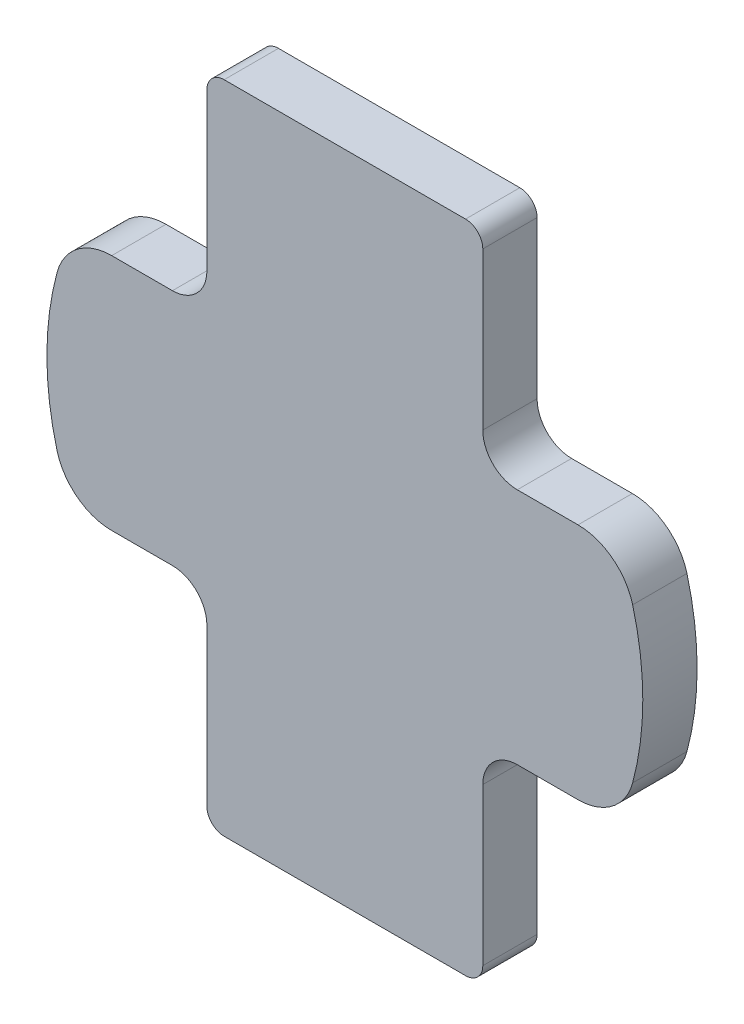
ISO-10303-21;
HEADER;
FILE_DESCRIPTION(('STEP AP214'),'2;1');
FILE_NAME('part.step','',(''),(''),'','','');
FILE_SCHEMA(('AUTOMOTIVE_DESIGN { 1 0 10303 214 1 1 1 1 }'));
ENDSEC;
DATA;
#1=APPLICATION_CONTEXT('core data for automotive mechanical design processes');
#2=APPLICATION_PROTOCOL_DEFINITION('international standard','automotive_design',2000,#1);
#3=PRODUCT_CONTEXT('',#1,'mechanical');
#4=PRODUCT('Part','Part','',(#3));
#5=PRODUCT_RELATED_PRODUCT_CATEGORY('part','',(#4));
#6=PRODUCT_DEFINITION_FORMATION('','',#4);
#7=PRODUCT_DEFINITION_CONTEXT('part definition',#1,'design');
#8=PRODUCT_DEFINITION('design','',#6,#7);
#9=PRODUCT_DEFINITION_SHAPE('','',#8);
#10=(LENGTH_UNIT() NAMED_UNIT(*) SI_UNIT(.MILLI.,.METRE.));
#11=(NAMED_UNIT(*) PLANE_ANGLE_UNIT() SI_UNIT($,.RADIAN.));
#12=(NAMED_UNIT(*) SI_UNIT($,.STERADIAN.) SOLID_ANGLE_UNIT());
#13=UNCERTAINTY_MEASURE_WITH_UNIT(LENGTH_MEASURE(1.E-05),#10,'distance_accuracy_value','');
#14=(GEOMETRIC_REPRESENTATION_CONTEXT(3) GLOBAL_UNCERTAINTY_ASSIGNED_CONTEXT((#13)) GLOBAL_UNIT_ASSIGNED_CONTEXT((#10,
#11,#12)) REPRESENTATION_CONTEXT('',''));
#15=CARTESIAN_POINT('',(0.,0.,0.));
#16=DIRECTION('',(0.,0.,1.));
#17=DIRECTION('',(1.,0.,0.));
#18=AXIS2_PLACEMENT_3D('',#15,#16,#17);
#19=CARTESIAN_POINT('',(-1.21922822000749,60.325,10.));
#20=DIRECTION('',(0.,-1.,0.));
#21=DIRECTION('',(0.,0.,-1.));
#22=AXIS2_PLACEMENT_3D('',#19,#20,#21);
#23=PLANE('',#22);
#24=DIRECTION('',(-1.,0.,0.));
#25=VECTOR('',#24,1.);
#26=CARTESIAN_POINT('',(-1.21922822000749,60.325,0.));
#27=LINE('',#26,#25);
#28=CARTESIAN_POINT('',(22.225,60.325,0.));
#29=VERTEX_POINT('',#28);
#30=CARTESIAN_POINT('',(-22.225,60.325,0.));
#31=VERTEX_POINT('',#30);
#32=EDGE_CURVE('E239',#29,#31,#27,.T.);
#33=ORIENTED_EDGE('',*,*,#32,.T.);
#34=DIRECTION('',(0.,0.,-1.));
#35=VECTOR('',#34,1.);
#36=CARTESIAN_POINT('',(-22.225,60.325,10.));
#37=LINE('',#36,#35);
#38=CARTESIAN_POINT('',(-22.225,60.325,10.));
#39=VERTEX_POINT('',#38);
#40=EDGE_CURVE('E11',#39,#31,#37,.T.);
#41=ORIENTED_EDGE('',*,*,#40,.F.);
#42=DIRECTION('',(-1.,0.,0.));
#43=VECTOR('',#42,1.);
#44=CARTESIAN_POINT('',(-1.21922822000749,60.325,10.));
#45=LINE('',#44,#43);
#46=CARTESIAN_POINT('',(22.225,60.325,10.));
#47=VERTEX_POINT('',#46);
#48=EDGE_CURVE('E302',#47,#39,#45,.T.);
#49=ORIENTED_EDGE('',*,*,#48,.F.);
#50=DIRECTION('',(0.,0.,-1.));
#51=VECTOR('',#50,1.);
#52=CARTESIAN_POINT('',(22.225,60.325,10.));
#53=LINE('',#52,#51);
#54=EDGE_CURVE('E49',#47,#29,#53,.T.);
#55=ORIENTED_EDGE('',*,*,#54,.T.);
#56=EDGE_LOOP('',(#33,#41,#49,#55));
#57=FACE_BOUND('',#56,.T.);
#58=ADVANCED_FACE('F33',(#57),#23,.F.);
#59=CARTESIAN_POINT('',(-22.225,57.15,10.));
#60=DIRECTION('',(0.,0.,-1.));
#61=DIRECTION('',(-1.,0.,0.));
#62=AXIS2_PLACEMENT_3D('',#59,#60,#61);
#63=CYLINDRICAL_SURFACE('',#62,3.175);
#64=CARTESIAN_POINT('',(-22.225,57.15,0.));
#65=DIRECTION('',(0.,0.,1.));
#66=DIRECTION('',(1.,0.,0.));
#67=AXIS2_PLACEMENT_3D('',#64,#65,#66);
#68=CIRCLE('',#67,3.175);
#69=CARTESIAN_POINT('',(-25.4,57.15,0.));
#70=VERTEX_POINT('',#69);
#71=EDGE_CURVE('E241',#31,#70,#68,.T.);
#72=ORIENTED_EDGE('',*,*,#71,.T.);
#73=DIRECTION('',(0.,0.,-1.));
#74=VECTOR('',#73,1.);
#75=CARTESIAN_POINT('',(-25.4,57.15,10.));
#76=LINE('',#75,#74);
#77=CARTESIAN_POINT('',(-25.4,57.15,10.));
#78=VERTEX_POINT('',#77);
#79=EDGE_CURVE('E41',#78,#70,#76,.T.);
#80=ORIENTED_EDGE('',*,*,#79,.F.);
#81=CARTESIAN_POINT('',(-22.225,57.15,10.));
#82=DIRECTION('',(0.,0.,1.));
#83=DIRECTION('',(1.,0.,0.));
#84=AXIS2_PLACEMENT_3D('',#81,#82,#83);
#85=CIRCLE('',#84,3.175);
#86=EDGE_CURVE('E142',#39,#78,#85,.T.);
#87=ORIENTED_EDGE('',*,*,#86,.F.);
#88=ORIENTED_EDGE('',*,*,#40,.T.);
#89=EDGE_LOOP('',(#72,#80,#87,#88));
#90=FACE_BOUND('',#89,.T.);
#91=ADVANCED_FACE('F440',(#90),#63,.T.);
#92=CARTESIAN_POINT('',(-25.4,-123.866634737692,10.));
#93=DIRECTION('',(1.,0.,0.));
#94=DIRECTION('',(0.,0.,-1.));
#95=AXIS2_PLACEMENT_3D('',#92,#93,#94);
#96=PLANE('',#95);
#97=DIRECTION('',(0.,-1.,0.));
#98=VECTOR('',#97,1.);
#99=CARTESIAN_POINT('',(-25.4,-123.866634737692,0.));
#100=LINE('',#99,#98);
#101=CARTESIAN_POINT('',(-25.4,28.2689300000001,0.));
#102=VERTEX_POINT('',#101);
#103=EDGE_CURVE('E243',#70,#102,#100,.T.);
#104=ORIENTED_EDGE('',*,*,#103,.T.);
#105=DIRECTION('',(0.,0.,-1.));
#106=VECTOR('',#105,1.);
#107=CARTESIAN_POINT('',(-25.4,28.2689300000001,10.));
#108=LINE('',#107,#106);
#109=CARTESIAN_POINT('',(-25.4,28.2689300000001,10.));
#110=VERTEX_POINT('',#109);
#111=EDGE_CURVE('E352',#110,#102,#108,.T.);
#112=ORIENTED_EDGE('',*,*,#111,.F.);
#113=DIRECTION('',(0.,-1.,0.));
#114=VECTOR('',#113,1.);
#115=CARTESIAN_POINT('',(-25.4,-123.866634737692,10.));
#116=LINE('',#115,#114);
#117=EDGE_CURVE('E360',#78,#110,#116,.T.);
#118=ORIENTED_EDGE('',*,*,#117,.F.);
#119=ORIENTED_EDGE('',*,*,#79,.T.);
#120=EDGE_LOOP('',(#104,#112,#118,#119));
#121=FACE_BOUND('',#120,.T.);
#122=ADVANCED_FACE('F358',(#121),#96,.F.);
#123=CARTESIAN_POINT('',(-31.75,28.26893,10.));
#124=DIRECTION('',(0.,0.,-1.));
#125=DIRECTION('',(-1.,0.,0.));
#126=AXIS2_PLACEMENT_3D('',#123,#124,#125);
#127=CYLINDRICAL_SURFACE('',#126,6.35);
#128=CARTESIAN_POINT('',(-31.75,28.26893,0.));
#129=DIRECTION('',(0.,0.,1.));
#130=DIRECTION('',(1.,0.,0.));
#131=AXIS2_PLACEMENT_3D('',#128,#129,#130);
#132=CIRCLE('',#131,6.35);
#133=CARTESIAN_POINT('',(-31.75,21.91893,0.));
#134=VERTEX_POINT('',#133);
#135=EDGE_CURVE('E245',#102,#134,#132,.F.);
#136=ORIENTED_EDGE('',*,*,#135,.T.);
#137=DIRECTION('',(0.,0.,-1.));
#138=VECTOR('',#137,1.);
#139=CARTESIAN_POINT('',(-31.75,21.91893,10.));
#140=LINE('',#139,#138);
#141=CARTESIAN_POINT('',(-31.75,21.91893,10.));
#142=VERTEX_POINT('',#141);
#143=EDGE_CURVE('E349',#142,#134,#140,.T.);
#144=ORIENTED_EDGE('',*,*,#143,.F.);
#145=CARTESIAN_POINT('',(-31.75,28.26893,10.));
#146=DIRECTION('',(0.,0.,1.));
#147=DIRECTION('',(1.,0.,0.));
#148=AXIS2_PLACEMENT_3D('',#145,#146,#147);
#149=CIRCLE('',#148,6.35);
#150=EDGE_CURVE('E377',#110,#142,#149,.F.);
#151=ORIENTED_EDGE('',*,*,#150,.F.);
#152=ORIENTED_EDGE('',*,*,#111,.T.);
#153=EDGE_LOOP('',(#136,#144,#151,#152));
#154=FACE_BOUND('',#153,.T.);
#155=ADVANCED_FACE('F368',(#154),#127,.F.);
#156=CARTESIAN_POINT('',(-1.21922822000744,21.91893,10.));
#157=DIRECTION('',(0.,-1.,0.));
#158=DIRECTION('',(1.,0.,0.));
#159=AXIS2_PLACEMENT_3D('',#156,#157,#158);
#160=PLANE('',#159);
#161=DIRECTION('',(-1.,0.,0.));
#162=VECTOR('',#161,1.);
#163=CARTESIAN_POINT('',(-1.21922822000744,21.91893,0.));
#164=LINE('',#163,#162);
#165=CARTESIAN_POINT('',(-42.9352895145136,21.91893,0.));
#166=VERTEX_POINT('',#165);
#167=EDGE_CURVE('E247',#134,#166,#164,.T.);
#168=ORIENTED_EDGE('',*,*,#167,.T.);
#169=DIRECTION('',(0.,0.,-1.));
#170=VECTOR('',#169,1.);
#171=CARTESIAN_POINT('',(-42.9352895145136,21.91893,10.));
#172=LINE('',#171,#170);
#173=CARTESIAN_POINT('',(-42.9352895145136,21.91893,10.));
#174=VERTEX_POINT('',#173);
#175=EDGE_CURVE('E346',#174,#166,#172,.T.);
#176=ORIENTED_EDGE('',*,*,#175,.F.);
#177=DIRECTION('',(-1.,0.,0.));
#178=VECTOR('',#177,1.);
#179=CARTESIAN_POINT('',(-1.21922822000744,21.91893,10.));
#180=LINE('',#179,#178);
#181=EDGE_CURVE('E374',#142,#174,#180,.T.);
#182=ORIENTED_EDGE('',*,*,#181,.F.);
#183=ORIENTED_EDGE('',*,*,#143,.T.);
#184=EDGE_LOOP('',(#168,#176,#182,#183));
#185=FACE_BOUND('',#184,.T.);
#186=ADVANCED_FACE('F372',(#185),#160,.F.);
#187=CARTESIAN_POINT('',(-42.9352895145136,11.50493,10.));
#188=DIRECTION('',(0.,0.,-1.));
#189=DIRECTION('',(-1.,0.,0.));
#190=AXIS2_PLACEMENT_3D('',#187,#188,#189);
#191=CYLINDRICAL_SURFACE('',#190,10.414);
#192=CARTESIAN_POINT('',(-42.9352895145136,11.50493,0.));
#193=DIRECTION('',(0.,0.,1.));
#194=DIRECTION('',(1.,0.,0.));
#195=AXIS2_PLACEMENT_3D('',#192,#193,#194);
#196=CIRCLE('',#195,10.414);
#197=CARTESIAN_POINT('',(-52.9944144864853,14.2003707428571,0.));
#198=VERTEX_POINT('',#197);
#199=EDGE_CURVE('E249',#166,#198,#196,.T.);
#200=ORIENTED_EDGE('',*,*,#199,.T.);
#201=DIRECTION('',(0.,0.,-1.));
#202=VECTOR('',#201,1.);
#203=CARTESIAN_POINT('',(-52.9944144864853,14.2003707428571,10.));
#204=LINE('',#203,#202);
#205=CARTESIAN_POINT('',(-52.9944144864853,14.2003707428571,10.));
#206=VERTEX_POINT('',#205);
#207=EDGE_CURVE('E343',#206,#198,#204,.T.);
#208=ORIENTED_EDGE('',*,*,#207,.F.);
#209=CARTESIAN_POINT('',(-42.9352895145136,11.50493,10.));
#210=DIRECTION('',(0.,0.,1.));
#211=DIRECTION('',(1.,0.,0.));
#212=AXIS2_PLACEMENT_3D('',#209,#210,#211);
#213=CIRCLE('',#212,10.414);
#214=EDGE_CURVE('E376',#174,#206,#213,.T.);
#215=ORIENTED_EDGE('',*,*,#214,.F.);
#216=ORIENTED_EDGE('',*,*,#175,.T.);
#217=EDGE_LOOP('',(#200,#208,#215,#216));
#218=FACE_BOUND('',#217,.T.);
#219=ADVANCED_FACE('F456',(#218),#191,.T.);
#220=CARTESIAN_POINT('',(0.,0.,10.));
#221=DIRECTION('',(0.,0.,-1.));
#222=DIRECTION('',(-1.,0.,0.));
#223=AXIS2_PLACEMENT_3D('',#220,#221,#222);
#224=CYLINDRICAL_SURFACE('',#223,54.864);
#225=CARTESIAN_POINT('',(0.,0.,0.));
#226=DIRECTION('',(0.,0.,1.));
#227=DIRECTION('',(1.,0.,0.));
#228=AXIS2_PLACEMENT_3D('',#225,#226,#227);
#229=CIRCLE('',#228,54.864);
#230=CARTESIAN_POINT('',(-54.864,0.0215978902018688,0.));
#231=VERTEX_POINT('',#230);
#232=EDGE_CURVE('E251',#198,#231,#229,.T.);
#233=ORIENTED_EDGE('',*,*,#232,.T.);
#234=DIRECTION('',(0.,0.,-1.));
#235=VECTOR('',#234,1.);
#236=CARTESIAN_POINT('',(-54.864,0.0215978902018688,10.));
#237=LINE('',#236,#235);
#238=CARTESIAN_POINT('',(-54.864,0.0215978902018688,10.));
#239=VERTEX_POINT('',#238);
#240=EDGE_CURVE('E340',#239,#231,#237,.T.);
#241=ORIENTED_EDGE('',*,*,#240,.F.);
#242=CARTESIAN_POINT('',(0.,0.,10.));
#243=DIRECTION('',(0.,0.,1.));
#244=DIRECTION('',(1.,0.,0.));
#245=AXIS2_PLACEMENT_3D('',#242,#243,#244);
#246=CIRCLE('',#245,54.864);
#247=EDGE_CURVE('E379',#206,#239,#246,.T.);
#248=ORIENTED_EDGE('',*,*,#247,.F.);
#249=ORIENTED_EDGE('',*,*,#207,.T.);
#250=EDGE_LOOP('',(#233,#241,#248,#249));
#251=FACE_BOUND('',#250,.T.);
#252=ADVANCED_FACE('F459',(#251),#224,.T.);
#253=CARTESIAN_POINT('',(-54.864,-123.866634737692,10.));
#254=DIRECTION('',(1.,0.,0.));
#255=DIRECTION('',(0.,0.,-1.));
#256=AXIS2_PLACEMENT_3D('',#253,#254,#255);
#257=PLANE('',#256);
#258=DIRECTION('',(0.,-1.,0.));
#259=VECTOR('',#258,1.);
#260=CARTESIAN_POINT('',(-54.864,-123.866634737692,0.));
#261=LINE('',#260,#259);
#262=CARTESIAN_POINT('',(-54.864,0.,0.));
#263=VERTEX_POINT('',#262);
#264=EDGE_CURVE('E253',#231,#263,#261,.T.);
#265=ORIENTED_EDGE('',*,*,#264,.T.);
#266=DIRECTION('',(0.,0.,-1.));
#267=VECTOR('',#266,1.);
#268=CARTESIAN_POINT('',(-54.864,0.,10.));
#269=LINE('',#268,#267);
#270=CARTESIAN_POINT('',(-54.864,0.,10.));
#271=VERTEX_POINT('',#270);
#272=EDGE_CURVE('E337',#271,#263,#269,.T.);
#273=ORIENTED_EDGE('',*,*,#272,.F.);
#274=DIRECTION('',(0.,-1.,0.));
#275=VECTOR('',#274,1.);
#276=CARTESIAN_POINT('',(-54.864,-123.866634737692,10.));
#277=LINE('',#276,#275);
#278=EDGE_CURVE('E385',#239,#271,#277,.T.);
#279=ORIENTED_EDGE('',*,*,#278,.F.);
#280=ORIENTED_EDGE('',*,*,#240,.T.);
#281=EDGE_LOOP('',(#265,#273,#279,#280));
#282=FACE_BOUND('',#281,.T.);
#283=ADVANCED_FACE('F461',(#282),#257,.F.);
#284=CARTESIAN_POINT('',(-52.9944144864853,-14.2003707428571,0.));
#285=VERTEX_POINT('',#284);
#286=EDGE_CURVE('E254',#263,#285,#229,.T.);
#287=ORIENTED_EDGE('',*,*,#286,.T.);
#288=DIRECTION('',(0.,0.,-1.));
#289=VECTOR('',#288,1.);
#290=CARTESIAN_POINT('',(-52.9944144864853,-14.2003707428571,10.));
#291=LINE('',#290,#289);
#292=CARTESIAN_POINT('',(-52.9944144864853,-14.2003707428571,10.));
#293=VERTEX_POINT('',#292);
#294=EDGE_CURVE('E334',#293,#285,#291,.T.);
#295=ORIENTED_EDGE('',*,*,#294,.F.);
#296=EDGE_CURVE('E386',#271,#293,#246,.T.);
#297=ORIENTED_EDGE('',*,*,#296,.F.);
#298=ORIENTED_EDGE('',*,*,#272,.T.);
#299=EDGE_LOOP('',(#287,#295,#297,#298));
#300=FACE_BOUND('',#299,.T.);
#301=ADVANCED_FACE('F464',(#300),#224,.T.);
#302=CARTESIAN_POINT('',(-42.9352895145136,-11.50493,10.));
#303=DIRECTION('',(0.,0.,-1.));
#304=DIRECTION('',(-1.,0.,0.));
#305=AXIS2_PLACEMENT_3D('',#302,#303,#304);
#306=CYLINDRICAL_SURFACE('',#305,10.414);
#307=CARTESIAN_POINT('',(-42.9352895145136,-11.50493,0.));
#308=DIRECTION('',(0.,0.,1.));
#309=DIRECTION('',(1.,0.,0.));
#310=AXIS2_PLACEMENT_3D('',#307,#308,#309);
#311=CIRCLE('',#310,10.414);
#312=CARTESIAN_POINT('',(-42.9352895145136,-21.91893,0.));
#313=VERTEX_POINT('',#312);
#314=EDGE_CURVE('E256',#285,#313,#311,.T.);
#315=ORIENTED_EDGE('',*,*,#314,.T.);
#316=DIRECTION('',(0.,0.,-1.));
#317=VECTOR('',#316,1.);
#318=CARTESIAN_POINT('',(-42.9352895145136,-21.91893,10.));
#319=LINE('',#318,#317);
#320=CARTESIAN_POINT('',(-42.9352895145136,-21.91893,10.));
#321=VERTEX_POINT('',#320);
#322=EDGE_CURVE('E332',#321,#313,#319,.T.);
#323=ORIENTED_EDGE('',*,*,#322,.F.);
#324=CARTESIAN_POINT('',(-42.9352895145136,-11.50493,10.));
#325=DIRECTION('',(0.,0.,1.));
#326=DIRECTION('',(1.,0.,0.));
#327=AXIS2_PLACEMENT_3D('',#324,#325,#326);
#328=CIRCLE('',#327,10.414);
#329=EDGE_CURVE('E388',#293,#321,#328,.T.);
#330=ORIENTED_EDGE('',*,*,#329,.F.);
#331=ORIENTED_EDGE('',*,*,#294,.T.);
#332=EDGE_LOOP('',(#315,#323,#330,#331));
#333=FACE_BOUND('',#332,.T.);
#334=ADVANCED_FACE('F468',(#333),#306,.T.);
#335=CARTESIAN_POINT('',(-1.21922822000749,-21.91893,10.));
#336=DIRECTION('',(0.,-1.,0.));
#337=DIRECTION('',(0.,0.,-1.));
#338=AXIS2_PLACEMENT_3D('',#335,#336,#337);
#339=PLANE('',#338);
#340=DIRECTION('',(-1.,0.,0.));
#341=VECTOR('',#340,1.);
#342=CARTESIAN_POINT('',(-1.21922822000749,-21.91893,0.));
#343=LINE('',#342,#341);
#344=CARTESIAN_POINT('',(-31.75,-21.91893,0.));
#345=VERTEX_POINT('',#344);
#346=EDGE_CURVE('E259',#345,#313,#343,.T.);
#347=ORIENTED_EDGE('',*,*,#346,.F.);
#348=DIRECTION('',(0.,0.,-1.));
#349=VECTOR('',#348,1.);
#350=CARTESIAN_POINT('',(-31.75,-21.91893,10.));
#351=LINE('',#350,#349);
#352=CARTESIAN_POINT('',(-31.75,-21.91893,10.));
#353=VERTEX_POINT('',#352);
#354=EDGE_CURVE('E330',#353,#345,#351,.T.);
#355=ORIENTED_EDGE('',*,*,#354,.F.);
#356=DIRECTION('',(-1.,0.,0.));
#357=VECTOR('',#356,1.);
#358=CARTESIAN_POINT('',(-1.21922822000749,-21.91893,10.));
#359=LINE('',#358,#357);
#360=EDGE_CURVE('E390',#353,#321,#359,.T.);
#361=ORIENTED_EDGE('',*,*,#360,.T.);
#362=ORIENTED_EDGE('',*,*,#322,.T.);
#363=EDGE_LOOP('',(#347,#355,#361,#362));
#364=FACE_BOUND('',#363,.T.);
#365=ADVANCED_FACE('F472',(#364),#339,.T.);
#366=CARTESIAN_POINT('',(-31.75,-28.26893,10.));
#367=DIRECTION('',(0.,0.,-1.));
#368=DIRECTION('',(-1.,0.,0.));
#369=AXIS2_PLACEMENT_3D('',#366,#367,#368);
#370=CYLINDRICAL_SURFACE('',#369,6.35);
#371=CARTESIAN_POINT('',(-31.75,-28.26893,0.));
#372=DIRECTION('',(0.,0.,1.));
#373=DIRECTION('',(1.,0.,0.));
#374=AXIS2_PLACEMENT_3D('',#371,#372,#373);
#375=CIRCLE('',#374,6.35);
#376=CARTESIAN_POINT('',(-25.4,-28.2689300000001,0.));
#377=VERTEX_POINT('',#376);
#378=EDGE_CURVE('E262',#345,#377,#375,.F.);
#379=ORIENTED_EDGE('',*,*,#378,.T.);
#380=DIRECTION('',(0.,0.,-1.));
#381=VECTOR('',#380,1.);
#382=CARTESIAN_POINT('',(-25.4,-28.2689300000001,10.));
#383=LINE('',#382,#381);
#384=CARTESIAN_POINT('',(-25.4,-28.2689300000001,10.));
#385=VERTEX_POINT('',#384);
#386=EDGE_CURVE('E328',#385,#377,#383,.T.);
#387=ORIENTED_EDGE('',*,*,#386,.F.);
#388=CARTESIAN_POINT('',(-31.75,-28.26893,10.));
#389=DIRECTION('',(0.,0.,1.));
#390=DIRECTION('',(1.,0.,0.));
#391=AXIS2_PLACEMENT_3D('',#388,#389,#390);
#392=CIRCLE('',#391,6.35);
#393=EDGE_CURVE('E393',#353,#385,#392,.F.);
#394=ORIENTED_EDGE('',*,*,#393,.F.);
#395=ORIENTED_EDGE('',*,*,#354,.T.);
#396=EDGE_LOOP('',(#379,#387,#394,#395));
#397=FACE_BOUND('',#396,.T.);
#398=ADVANCED_FACE('F476',(#397),#370,.F.);
#399=CARTESIAN_POINT('',(-25.4,-123.866634737692,10.));
#400=DIRECTION('',(-1.,0.,0.));
#401=DIRECTION('',(0.,0.,1.));
#402=AXIS2_PLACEMENT_3D('',#399,#400,#401);
#403=PLANE('',#402);
#404=DIRECTION('',(0.,1.,0.));
#405=VECTOR('',#404,1.);
#406=CARTESIAN_POINT('',(-25.4,-123.866634737692,0.));
#407=LINE('',#406,#405);
#408=CARTESIAN_POINT('',(-25.4,-57.15,0.));
#409=VERTEX_POINT('',#408);
#410=EDGE_CURVE('E265',#409,#377,#407,.T.);
#411=ORIENTED_EDGE('',*,*,#410,.F.);
#412=DIRECTION('',(0.,0.,-1.));
#413=VECTOR('',#412,1.);
#414=CARTESIAN_POINT('',(-25.4,-57.15,10.));
#415=LINE('',#414,#413);
#416=CARTESIAN_POINT('',(-25.4,-57.15,10.));
#417=VERTEX_POINT('',#416);
#418=EDGE_CURVE('E326',#417,#409,#415,.T.);
#419=ORIENTED_EDGE('',*,*,#418,.F.);
#420=DIRECTION('',(0.,1.,0.));
#421=VECTOR('',#420,1.);
#422=CARTESIAN_POINT('',(-25.4,-123.866634737692,10.));
#423=LINE('',#422,#421);
#424=EDGE_CURVE('E395',#417,#385,#423,.T.);
#425=ORIENTED_EDGE('',*,*,#424,.T.);
#426=ORIENTED_EDGE('',*,*,#386,.T.);
#427=EDGE_LOOP('',(#411,#419,#425,#426));
#428=FACE_BOUND('',#427,.T.);
#429=ADVANCED_FACE('F480',(#428),#403,.T.);
#430=CARTESIAN_POINT('',(-22.225,-57.15,10.));
#431=DIRECTION('',(0.,0.,-1.));
#432=DIRECTION('',(-1.,0.,0.));
#433=AXIS2_PLACEMENT_3D('',#430,#431,#432);
#434=CYLINDRICAL_SURFACE('',#433,3.175);
#435=CARTESIAN_POINT('',(-22.225,-57.15,0.));
#436=DIRECTION('',(0.,0.,1.));
#437=DIRECTION('',(1.,0.,0.));
#438=AXIS2_PLACEMENT_3D('',#435,#436,#437);
#439=CIRCLE('',#438,3.175);
#440=CARTESIAN_POINT('',(-22.225,-60.325,0.));
#441=VERTEX_POINT('',#440);
#442=EDGE_CURVE('E268',#409,#441,#439,.T.);
#443=ORIENTED_EDGE('',*,*,#442,.T.);
#444=DIRECTION('',(0.,0.,-1.));
#445=VECTOR('',#444,1.);
#446=CARTESIAN_POINT('',(-22.225,-60.325,10.));
#447=LINE('',#446,#445);
#448=CARTESIAN_POINT('',(-22.225,-60.325,10.));
#449=VERTEX_POINT('',#448);
#450=EDGE_CURVE('E324',#449,#441,#447,.T.);
#451=ORIENTED_EDGE('',*,*,#450,.F.);
#452=CARTESIAN_POINT('',(-22.225,-57.15,10.));
#453=DIRECTION('',(0.,0.,1.));
#454=DIRECTION('',(1.,0.,0.));
#455=AXIS2_PLACEMENT_3D('',#452,#453,#454);
#456=CIRCLE('',#455,3.175);
#457=EDGE_CURVE('E398',#417,#449,#456,.T.);
#458=ORIENTED_EDGE('',*,*,#457,.F.);
#459=ORIENTED_EDGE('',*,*,#418,.T.);
#460=EDGE_LOOP('',(#443,#451,#458,#459));
#461=FACE_BOUND('',#460,.T.);
#462=ADVANCED_FACE('F484',(#461),#434,.T.);
#463=CARTESIAN_POINT('',(-1.2192282200075,-60.325,10.));
#464=DIRECTION('',(0.,-1.,0.));
#465=DIRECTION('',(1.,0.,0.));
#466=AXIS2_PLACEMENT_3D('',#463,#464,#465);
#467=PLANE('',#466);
#468=DIRECTION('',(-1.,0.,0.));
#469=VECTOR('',#468,1.);
#470=CARTESIAN_POINT('',(-1.2192282200075,-60.325,0.));
#471=LINE('',#470,#469);
#472=CARTESIAN_POINT('',(22.225,-60.325,0.));
#473=VERTEX_POINT('',#472);
#474=EDGE_CURVE('E271',#473,#441,#471,.T.);
#475=ORIENTED_EDGE('',*,*,#474,.F.);
#476=DIRECTION('',(0.,0.,-1.));
#477=VECTOR('',#476,1.);
#478=CARTESIAN_POINT('',(22.225,-60.325,10.));
#479=LINE('',#478,#477);
#480=CARTESIAN_POINT('',(22.225,-60.325,10.));
#481=VERTEX_POINT('',#480);
#482=EDGE_CURVE('E322',#481,#473,#479,.T.);
#483=ORIENTED_EDGE('',*,*,#482,.F.);
#484=DIRECTION('',(-1.,0.,0.));
#485=VECTOR('',#484,1.);
#486=CARTESIAN_POINT('',(-1.2192282200075,-60.325,10.));
#487=LINE('',#486,#485);
#488=EDGE_CURVE('E400',#481,#449,#487,.T.);
#489=ORIENTED_EDGE('',*,*,#488,.T.);
#490=ORIENTED_EDGE('',*,*,#450,.T.);
#491=EDGE_LOOP('',(#475,#483,#489,#490));
#492=FACE_BOUND('',#491,.T.);
#493=ADVANCED_FACE('F488',(#492),#467,.T.);
#494=CARTESIAN_POINT('',(22.225,-57.15,10.));
#495=DIRECTION('',(0.,0.,-1.));
#496=DIRECTION('',(-1.,0.,0.));
#497=AXIS2_PLACEMENT_3D('',#494,#495,#496);
#498=CYLINDRICAL_SURFACE('',#497,3.175);
#499=CARTESIAN_POINT('',(22.225,-57.15,0.));
#500=DIRECTION('',(0.,0.,1.));
#501=DIRECTION('',(1.,0.,0.));
#502=AXIS2_PLACEMENT_3D('',#499,#500,#501);
#503=CIRCLE('',#502,3.175);
#504=CARTESIAN_POINT('',(25.4,-57.1499999999999,0.));
#505=VERTEX_POINT('',#504);
#506=EDGE_CURVE('E274',#505,#473,#503,.F.);
#507=ORIENTED_EDGE('',*,*,#506,.F.);
#508=DIRECTION('',(0.,0.,-1.));
#509=VECTOR('',#508,1.);
#510=CARTESIAN_POINT('',(25.4,-57.1499999999999,10.));
#511=LINE('',#510,#509);
#512=CARTESIAN_POINT('',(25.4,-57.1499999999999,10.));
#513=VERTEX_POINT('',#512);
#514=EDGE_CURVE('E320',#513,#505,#511,.T.);
#515=ORIENTED_EDGE('',*,*,#514,.F.);
#516=CARTESIAN_POINT('',(22.225,-57.15,10.));
#517=DIRECTION('',(0.,0.,1.));
#518=DIRECTION('',(1.,0.,0.));
#519=AXIS2_PLACEMENT_3D('',#516,#517,#518);
#520=CIRCLE('',#519,3.175);
#521=EDGE_CURVE('E403',#513,#481,#520,.F.);
#522=ORIENTED_EDGE('',*,*,#521,.T.);
#523=ORIENTED_EDGE('',*,*,#482,.T.);
#524=EDGE_LOOP('',(#507,#515,#522,#523));
#525=FACE_BOUND('',#524,.T.);
#526=ADVANCED_FACE('F492',(#525),#498,.T.);
#527=CARTESIAN_POINT('',(25.4,-123.866634737692,10.));
#528=DIRECTION('',(1.,0.,0.));
#529=DIRECTION('',(0.,1.,0.));
#530=AXIS2_PLACEMENT_3D('',#527,#528,#529);
#531=PLANE('',#530);
#532=DIRECTION('',(0.,-1.,0.));
#533=VECTOR('',#532,1.);
#534=CARTESIAN_POINT('',(25.4,-123.866634737692,0.));
#535=LINE('',#534,#533);
#536=CARTESIAN_POINT('',(25.4,-28.26893,0.));
#537=VERTEX_POINT('',#536);
#538=EDGE_CURVE('E277',#537,#505,#535,.T.);
#539=ORIENTED_EDGE('',*,*,#538,.F.);
#540=DIRECTION('',(0.,0.,-1.));
#541=VECTOR('',#540,1.);
#542=CARTESIAN_POINT('',(25.4,-28.26893,10.));
#543=LINE('',#542,#541);
#544=CARTESIAN_POINT('',(25.4,-28.26893,10.));
#545=VERTEX_POINT('',#544);
#546=EDGE_CURVE('E318',#545,#537,#543,.T.);
#547=ORIENTED_EDGE('',*,*,#546,.F.);
#548=DIRECTION('',(0.,-1.,0.));
#549=VECTOR('',#548,1.);
#550=CARTESIAN_POINT('',(25.4,-123.866634737692,10.));
#551=LINE('',#550,#549);
#552=EDGE_CURVE('E406',#545,#513,#551,.T.);
#553=ORIENTED_EDGE('',*,*,#552,.T.);
#554=ORIENTED_EDGE('',*,*,#514,.T.);
#555=EDGE_LOOP('',(#539,#547,#553,#554));
#556=FACE_BOUND('',#555,.T.);
#557=ADVANCED_FACE('F496',(#556),#531,.T.);
#558=CARTESIAN_POINT('',(31.75,-28.26893,10.));
#559=DIRECTION('',(0.,0.,-1.));
#560=DIRECTION('',(-1.,0.,0.));
#561=AXIS2_PLACEMENT_3D('',#558,#559,#560);
#562=CYLINDRICAL_SURFACE('',#561,6.35);
#563=CARTESIAN_POINT('',(31.75,-28.26893,0.));
#564=DIRECTION('',(0.,0.,1.));
#565=DIRECTION('',(1.,0.,0.));
#566=AXIS2_PLACEMENT_3D('',#563,#564,#565);
#567=CIRCLE('',#566,6.35);
#568=CARTESIAN_POINT('',(31.7500000000001,-21.91893,0.));
#569=VERTEX_POINT('',#568);
#570=EDGE_CURVE('E280',#537,#569,#567,.F.);
#571=ORIENTED_EDGE('',*,*,#570,.T.);
#572=DIRECTION('',(0.,0.,-1.));
#573=VECTOR('',#572,1.);
#574=CARTESIAN_POINT('',(31.7500000000001,-21.91893,10.));
#575=LINE('',#574,#573);
#576=CARTESIAN_POINT('',(31.7500000000001,-21.91893,10.));
#577=VERTEX_POINT('',#576);
#578=EDGE_CURVE('E316',#577,#569,#575,.T.);
#579=ORIENTED_EDGE('',*,*,#578,.F.);
#580=CARTESIAN_POINT('',(31.75,-28.26893,10.));
#581=DIRECTION('',(0.,0.,1.));
#582=DIRECTION('',(1.,0.,0.));
#583=AXIS2_PLACEMENT_3D('',#580,#581,#582);
#584=CIRCLE('',#583,6.35);
#585=EDGE_CURVE('E409',#545,#577,#584,.F.);
#586=ORIENTED_EDGE('',*,*,#585,.F.);
#587=ORIENTED_EDGE('',*,*,#546,.T.);
#588=EDGE_LOOP('',(#571,#579,#586,#587));
#589=FACE_BOUND('',#588,.T.);
#590=ADVANCED_FACE('F500',(#589),#562,.F.);
#591=CARTESIAN_POINT('',(-1.21922822000739,-21.91893,10.));
#592=DIRECTION('',(0.,-1.,0.));
#593=DIRECTION('',(1.,0.,0.));
#594=AXIS2_PLACEMENT_3D('',#591,#592,#593);
#595=PLANE('',#594);
#596=DIRECTION('',(-1.,0.,0.));
#597=VECTOR('',#596,1.);
#598=CARTESIAN_POINT('',(-1.21922822000739,-21.91893,0.));
#599=LINE('',#598,#597);
#600=CARTESIAN_POINT('',(42.9352895145136,-21.91893,0.));
#601=VERTEX_POINT('',#600);
#602=EDGE_CURVE('E283',#601,#569,#599,.T.);
#603=ORIENTED_EDGE('',*,*,#602,.F.);
#604=DIRECTION('',(0.,0.,-1.));
#605=VECTOR('',#604,1.);
#606=CARTESIAN_POINT('',(42.9352895145136,-21.91893,10.));
#607=LINE('',#606,#605);
#608=CARTESIAN_POINT('',(42.9352895145136,-21.91893,10.));
#609=VERTEX_POINT('',#608);
#610=EDGE_CURVE('E314',#609,#601,#607,.T.);
#611=ORIENTED_EDGE('',*,*,#610,.F.);
#612=DIRECTION('',(-1.,0.,0.));
#613=VECTOR('',#612,1.);
#614=CARTESIAN_POINT('',(-1.21922822000739,-21.91893,10.));
#615=LINE('',#614,#613);
#616=EDGE_CURVE('E411',#609,#577,#615,.T.);
#617=ORIENTED_EDGE('',*,*,#616,.T.);
#618=ORIENTED_EDGE('',*,*,#578,.T.);
#619=EDGE_LOOP('',(#603,#611,#617,#618));
#620=FACE_BOUND('',#619,.T.);
#621=ADVANCED_FACE('F504',(#620),#595,.T.);
#622=CARTESIAN_POINT('',(42.9352895145136,-11.50493,10.));
#623=DIRECTION('',(0.,0.,-1.));
#624=DIRECTION('',(-1.,0.,0.));
#625=AXIS2_PLACEMENT_3D('',#622,#623,#624);
#626=CYLINDRICAL_SURFACE('',#625,10.414);
#627=CARTESIAN_POINT('',(42.9352895145136,-11.50493,0.));
#628=DIRECTION('',(0.,0.,1.));
#629=DIRECTION('',(1.,0.,0.));
#630=AXIS2_PLACEMENT_3D('',#627,#628,#629);
#631=CIRCLE('',#630,10.414);
#632=CARTESIAN_POINT('',(52.9944144864853,-14.2003707428571,0.));
#633=VERTEX_POINT('',#632);
#634=EDGE_CURVE('E286',#633,#601,#631,.F.);
#635=ORIENTED_EDGE('',*,*,#634,.F.);
#636=DIRECTION('',(0.,0.,-1.));
#637=VECTOR('',#636,1.);
#638=CARTESIAN_POINT('',(52.9944144864853,-14.2003707428571,10.));
#639=LINE('',#638,#637);
#640=CARTESIAN_POINT('',(52.9944144864853,-14.2003707428571,10.));
#641=VERTEX_POINT('',#640);
#642=EDGE_CURVE('E312',#641,#633,#639,.T.);
#643=ORIENTED_EDGE('',*,*,#642,.F.);
#644=CARTESIAN_POINT('',(42.9352895145136,-11.50493,10.));
#645=DIRECTION('',(0.,0.,1.));
#646=DIRECTION('',(1.,0.,0.));
#647=AXIS2_PLACEMENT_3D('',#644,#645,#646);
#648=CIRCLE('',#647,10.414);
#649=EDGE_CURVE('E414',#641,#609,#648,.F.);
#650=ORIENTED_EDGE('',*,*,#649,.T.);
#651=ORIENTED_EDGE('',*,*,#610,.T.);
#652=EDGE_LOOP('',(#635,#643,#650,#651));
#653=FACE_BOUND('',#652,.T.);
#654=ADVANCED_FACE('F508',(#653),#626,.T.);
#655=CARTESIAN_POINT('',(0.,0.,10.));
#656=DIRECTION('',(0.,0.,-1.));
#657=DIRECTION('',(-1.,0.,0.));
#658=AXIS2_PLACEMENT_3D('',#655,#656,#657);
#659=CYLINDRICAL_SURFACE('',#658,54.864);
#660=CARTESIAN_POINT('',(0.,0.,0.));
#661=DIRECTION('',(0.,0.,1.));
#662=DIRECTION('',(1.,0.,0.));
#663=AXIS2_PLACEMENT_3D('',#660,#661,#662);
#664=CIRCLE('',#663,54.864);
#665=CARTESIAN_POINT('',(52.9944144864853,14.2003707428571,0.));
#666=VERTEX_POINT('',#665);
#667=EDGE_CURVE('E289',#633,#666,#664,.T.);
#668=ORIENTED_EDGE('',*,*,#667,.T.);
#669=DIRECTION('',(0.,0.,-1.));
#670=VECTOR('',#669,1.);
#671=CARTESIAN_POINT('',(52.9944144864853,14.2003707428571,10.));
#672=LINE('',#671,#670);
#673=CARTESIAN_POINT('',(52.9944144864853,14.2003707428571,10.));
#674=VERTEX_POINT('',#673);
#675=EDGE_CURVE('E309',#674,#666,#672,.T.);
#676=ORIENTED_EDGE('',*,*,#675,.F.);
#677=CARTESIAN_POINT('',(0.,0.,10.));
#678=DIRECTION('',(0.,0.,1.));
#679=DIRECTION('',(1.,0.,0.));
#680=AXIS2_PLACEMENT_3D('',#677,#678,#679);
#681=CIRCLE('',#680,54.864);
#682=EDGE_CURVE('E417',#641,#674,#681,.T.);
#683=ORIENTED_EDGE('',*,*,#682,.F.);
#684=ORIENTED_EDGE('',*,*,#642,.T.);
#685=EDGE_LOOP('',(#668,#676,#683,#684));
#686=FACE_BOUND('',#685,.T.);
#687=ADVANCED_FACE('F512',(#686),#659,.T.);
#688=CARTESIAN_POINT('',(42.9352895145136,11.50493,10.));
#689=DIRECTION('',(0.,0.,-1.));
#690=DIRECTION('',(-1.,0.,0.));
#691=AXIS2_PLACEMENT_3D('',#688,#689,#690);
#692=CYLINDRICAL_SURFACE('',#691,10.414);
#693=CARTESIAN_POINT('',(42.9352895145136,11.50493,0.));
#694=DIRECTION('',(0.,0.,1.));
#695=DIRECTION('',(1.,0.,0.));
#696=AXIS2_PLACEMENT_3D('',#693,#694,#695);
#697=CIRCLE('',#696,10.414);
#698=CARTESIAN_POINT('',(42.9352895145136,21.91893,0.));
#699=VERTEX_POINT('',#698);
#700=EDGE_CURVE('E291',#666,#699,#697,.T.);
#701=ORIENTED_EDGE('',*,*,#700,.T.);
#702=DIRECTION('',(0.,0.,-1.));
#703=VECTOR('',#702,1.);
#704=CARTESIAN_POINT('',(42.9352895145136,21.91893,10.));
#705=LINE('',#704,#703);
#706=CARTESIAN_POINT('',(42.9352895145136,21.91893,10.));
#707=VERTEX_POINT('',#706);
#708=EDGE_CURVE('E306',#707,#699,#705,.T.);
#709=ORIENTED_EDGE('',*,*,#708,.F.);
#710=CARTESIAN_POINT('',(42.9352895145136,11.50493,10.));
#711=DIRECTION('',(0.,0.,1.));
#712=DIRECTION('',(1.,0.,0.));
#713=AXIS2_PLACEMENT_3D('',#710,#711,#712);
#714=CIRCLE('',#713,10.414);
#715=EDGE_CURVE('E234',#674,#707,#714,.T.);
#716=ORIENTED_EDGE('',*,*,#715,.F.);
#717=ORIENTED_EDGE('',*,*,#675,.T.);
#718=EDGE_LOOP('',(#701,#709,#716,#717));
#719=FACE_BOUND('',#718,.T.);
#720=ADVANCED_FACE('F424',(#719),#692,.T.);
#721=CARTESIAN_POINT('',(-1.21922822000749,21.91893,10.));
#722=DIRECTION('',(0.,-1.,0.));
#723=DIRECTION('',(0.,0.,-1.));
#724=AXIS2_PLACEMENT_3D('',#721,#722,#723);
#725=PLANE('',#724);
#726=DIRECTION('',(-1.,0.,0.));
#727=VECTOR('',#726,1.);
#728=CARTESIAN_POINT('',(-1.21922822000749,21.91893,0.));
#729=LINE('',#728,#727);
#730=CARTESIAN_POINT('',(31.75,21.91893,0.));
#731=VERTEX_POINT('',#730);
#732=EDGE_CURVE('E293',#699,#731,#729,.T.);
#733=ORIENTED_EDGE('',*,*,#732,.T.);
#734=DIRECTION('',(0.,0.,-1.));
#735=VECTOR('',#734,1.);
#736=CARTESIAN_POINT('',(31.75,21.91893,10.));
#737=LINE('',#736,#735);
#738=CARTESIAN_POINT('',(31.75,21.91893,10.));
#739=VERTEX_POINT('',#738);
#740=EDGE_CURVE('E221',#739,#731,#737,.T.);
#741=ORIENTED_EDGE('',*,*,#740,.F.);
#742=DIRECTION('',(-1.,0.,0.));
#743=VECTOR('',#742,1.);
#744=CARTESIAN_POINT('',(-1.21922822000749,21.91893,10.));
#745=LINE('',#744,#743);
#746=EDGE_CURVE('E231',#707,#739,#745,.T.);
#747=ORIENTED_EDGE('',*,*,#746,.F.);
#748=ORIENTED_EDGE('',*,*,#708,.T.);
#749=EDGE_LOOP('',(#733,#741,#747,#748));
#750=FACE_BOUND('',#749,.T.);
#751=ADVANCED_FACE('F428',(#750),#725,.F.);
#752=CARTESIAN_POINT('',(31.75,28.26893,10.));
#753=DIRECTION('',(0.,0.,-1.));
#754=DIRECTION('',(-1.,0.,0.));
#755=AXIS2_PLACEMENT_3D('',#752,#753,#754);
#756=CYLINDRICAL_SURFACE('',#755,6.35);
#757=CARTESIAN_POINT('',(31.75,28.26893,0.));
#758=DIRECTION('',(0.,0.,1.));
#759=DIRECTION('',(1.,0.,0.));
#760=AXIS2_PLACEMENT_3D('',#757,#758,#759);
#761=CIRCLE('',#760,6.35);
#762=CARTESIAN_POINT('',(25.4,28.2689300000001,0.));
#763=VERTEX_POINT('',#762);
#764=EDGE_CURVE('E218',#763,#731,#761,.T.);
#765=ORIENTED_EDGE('',*,*,#764,.F.);
#766=DIRECTION('',(0.,0.,-1.));
#767=VECTOR('',#766,1.);
#768=CARTESIAN_POINT('',(25.4,28.2689300000001,10.));
#769=LINE('',#768,#767);
#770=CARTESIAN_POINT('',(25.4,28.2689300000001,10.));
#771=VERTEX_POINT('',#770);
#772=EDGE_CURVE('E212',#771,#763,#769,.T.);
#773=ORIENTED_EDGE('',*,*,#772,.F.);
#774=CARTESIAN_POINT('',(31.75,28.26893,10.));
#775=DIRECTION('',(0.,0.,1.));
#776=DIRECTION('',(1.,0.,0.));
#777=AXIS2_PLACEMENT_3D('',#774,#775,#776);
#778=CIRCLE('',#777,6.35);
#779=EDGE_CURVE('E216',#771,#739,#778,.T.);
#780=ORIENTED_EDGE('',*,*,#779,.T.);
#781=ORIENTED_EDGE('',*,*,#740,.T.);
#782=EDGE_LOOP('',(#765,#773,#780,#781));
#783=FACE_BOUND('',#782,.T.);
#784=ADVANCED_FACE('F214',(#783),#756,.F.);
#785=CARTESIAN_POINT('',(25.4,-123.866634737692,10.));
#786=DIRECTION('',(-1.,0.,0.));
#787=DIRECTION('',(0.,0.,1.));
#788=AXIS2_PLACEMENT_3D('',#785,#786,#787);
#789=PLANE('',#788);
#790=DIRECTION('',(0.,1.,0.));
#791=VECTOR('',#790,1.);
#792=CARTESIAN_POINT('',(25.4,-123.866634737692,0.));
#793=LINE('',#792,#791);
#794=CARTESIAN_POINT('',(25.4,57.15,0.));
#795=VERTEX_POINT('',#794);
#796=EDGE_CURVE('E297',#763,#795,#793,.T.);
#797=ORIENTED_EDGE('',*,*,#796,.T.);
#798=DIRECTION('',(0.,0.,-1.));
#799=VECTOR('',#798,1.);
#800=CARTESIAN_POINT('',(25.4,57.15,10.));
#801=LINE('',#800,#799);
#802=CARTESIAN_POINT('',(25.4,57.15,10.));
#803=VERTEX_POINT('',#802);
#804=EDGE_CURVE('E130',#803,#795,#801,.T.);
#805=ORIENTED_EDGE('',*,*,#804,.F.);
#806=DIRECTION('',(0.,1.,0.));
#807=VECTOR('',#806,1.);
#808=CARTESIAN_POINT('',(25.4,-123.866634737692,10.));
#809=LINE('',#808,#807);
#810=EDGE_CURVE('E223',#771,#803,#809,.T.);
#811=ORIENTED_EDGE('',*,*,#810,.F.);
#812=ORIENTED_EDGE('',*,*,#772,.T.);
#813=EDGE_LOOP('',(#797,#805,#811,#812));
#814=FACE_BOUND('',#813,.T.);
#815=ADVANCED_FACE('F224',(#814),#789,.F.);
#816=CARTESIAN_POINT('',(22.225,57.15,10.));
#817=DIRECTION('',(0.,0.,-1.));
#818=DIRECTION('',(-1.,0.,0.));
#819=AXIS2_PLACEMENT_3D('',#816,#817,#818);
#820=CYLINDRICAL_SURFACE('',#819,3.175);
#821=CARTESIAN_POINT('',(22.225,57.15,0.));
#822=DIRECTION('',(0.,0.,1.));
#823=DIRECTION('',(1.,0.,0.));
#824=AXIS2_PLACEMENT_3D('',#821,#822,#823);
#825=CIRCLE('',#824,3.175);
#826=EDGE_CURVE('E299',#29,#795,#825,.F.);
#827=ORIENTED_EDGE('',*,*,#826,.F.);
#828=ORIENTED_EDGE('',*,*,#54,.F.);
#829=CARTESIAN_POINT('',(22.225,57.15,10.));
#830=DIRECTION('',(0.,0.,1.));
#831=DIRECTION('',(1.,0.,0.));
#832=AXIS2_PLACEMENT_3D('',#829,#830,#831);
#833=CIRCLE('',#832,3.175);
#834=EDGE_CURVE('E227',#47,#803,#833,.F.);
#835=ORIENTED_EDGE('',*,*,#834,.T.);
#836=ORIENTED_EDGE('',*,*,#804,.T.);
#837=EDGE_LOOP('',(#827,#828,#835,#836));
#838=FACE_BOUND('',#837,.T.);
#839=ADVANCED_FACE('F429',(#838),#820,.T.);
#840=CARTESIAN_POINT('',(-1.21922822000749,-123.866634737692,10.));
#841=DIRECTION('',(0.,0.,1.));
#842=DIRECTION('',(1.,0.,0.));
#843=AXIS2_PLACEMENT_3D('',#840,#841,#842);
#844=PLANE('',#843);
#845=ORIENTED_EDGE('',*,*,#48,.T.);
#846=ORIENTED_EDGE('',*,*,#86,.T.);
#847=ORIENTED_EDGE('',*,*,#117,.T.);
#848=ORIENTED_EDGE('',*,*,#150,.T.);
#849=ORIENTED_EDGE('',*,*,#181,.T.);
#850=ORIENTED_EDGE('',*,*,#214,.T.);
#851=ORIENTED_EDGE('',*,*,#247,.T.);
#852=ORIENTED_EDGE('',*,*,#278,.T.);
#853=ORIENTED_EDGE('',*,*,#296,.T.);
#854=ORIENTED_EDGE('',*,*,#329,.T.);
#855=ORIENTED_EDGE('',*,*,#360,.F.);
#856=ORIENTED_EDGE('',*,*,#393,.T.);
#857=ORIENTED_EDGE('',*,*,#424,.F.);
#858=ORIENTED_EDGE('',*,*,#457,.T.);
#859=ORIENTED_EDGE('',*,*,#488,.F.);
#860=ORIENTED_EDGE('',*,*,#521,.F.);
#861=ORIENTED_EDGE('',*,*,#552,.F.);
#862=ORIENTED_EDGE('',*,*,#585,.T.);
#863=ORIENTED_EDGE('',*,*,#616,.F.);
#864=ORIENTED_EDGE('',*,*,#649,.F.);
#865=ORIENTED_EDGE('',*,*,#682,.T.);
#866=ORIENTED_EDGE('',*,*,#715,.T.);
#867=ORIENTED_EDGE('',*,*,#746,.T.);
#868=ORIENTED_EDGE('',*,*,#779,.F.);
#869=ORIENTED_EDGE('',*,*,#810,.T.);
#870=ORIENTED_EDGE('',*,*,#834,.F.);
#871=EDGE_LOOP('',(#845,#846,#847,#848,#849,#850,#851,#852,#853,#854,#855,#856,#857,#858,#859,
#860,#861,#862,#863,#864,#865,#866,#867,#868,#869,#870));
#872=FACE_BOUND('',#871,.T.);
#873=ADVANCED_FACE('F229',(#872),#844,.T.);
#874=CARTESIAN_POINT('',(-1.21922822000749,-123.866634737692,0.));
#875=DIRECTION('',(0.,0.,1.));
#876=DIRECTION('',(1.,0.,0.));
#877=AXIS2_PLACEMENT_3D('',#874,#875,#876);
#878=PLANE('',#877);
#879=ORIENTED_EDGE('',*,*,#32,.F.);
#880=ORIENTED_EDGE('',*,*,#826,.T.);
#881=ORIENTED_EDGE('',*,*,#796,.F.);
#882=ORIENTED_EDGE('',*,*,#764,.T.);
#883=ORIENTED_EDGE('',*,*,#732,.F.);
#884=ORIENTED_EDGE('',*,*,#700,.F.);
#885=ORIENTED_EDGE('',*,*,#667,.F.);
#886=ORIENTED_EDGE('',*,*,#634,.T.);
#887=ORIENTED_EDGE('',*,*,#602,.T.);
#888=ORIENTED_EDGE('',*,*,#570,.F.);
#889=ORIENTED_EDGE('',*,*,#538,.T.);
#890=ORIENTED_EDGE('',*,*,#506,.T.);
#891=ORIENTED_EDGE('',*,*,#474,.T.);
#892=ORIENTED_EDGE('',*,*,#442,.F.);
#893=ORIENTED_EDGE('',*,*,#410,.T.);
#894=ORIENTED_EDGE('',*,*,#378,.F.);
#895=ORIENTED_EDGE('',*,*,#346,.T.);
#896=ORIENTED_EDGE('',*,*,#314,.F.);
#897=ORIENTED_EDGE('',*,*,#286,.F.);
#898=ORIENTED_EDGE('',*,*,#264,.F.);
#899=ORIENTED_EDGE('',*,*,#232,.F.);
#900=ORIENTED_EDGE('',*,*,#199,.F.);
#901=ORIENTED_EDGE('',*,*,#167,.F.);
#902=ORIENTED_EDGE('',*,*,#135,.F.);
#903=ORIENTED_EDGE('',*,*,#103,.F.);
#904=ORIENTED_EDGE('',*,*,#71,.F.);
#905=EDGE_LOOP('',(#879,#880,#881,#882,#883,#884,#885,#886,#887,#888,#889,#890,#891,#892,#893,
#894,#895,#896,#897,#898,#899,#900,#901,#902,#903,#904));
#906=FACE_BOUND('',#905,.T.);
#907=ADVANCED_FACE('F363',(#906),#878,.F.);
#908=CLOSED_SHELL('',(#58,#91,#122,#155,#186,#219,#252,#283,#301,#334,#365,#398,#429,#462,#493,
#526,#557,#590,#621,#654,#687,#720,#751,#784,#815,#839,#873,#907));
#909=MANIFOLD_SOLID_BREP('B2',#908);
#910=ADVANCED_BREP_SHAPE_REPRESENTATION('',(#18,#909),#14);
#911=SHAPE_DEFINITION_REPRESENTATION(#9,#910);
ENDSEC;
END-ISO-10303-21;
